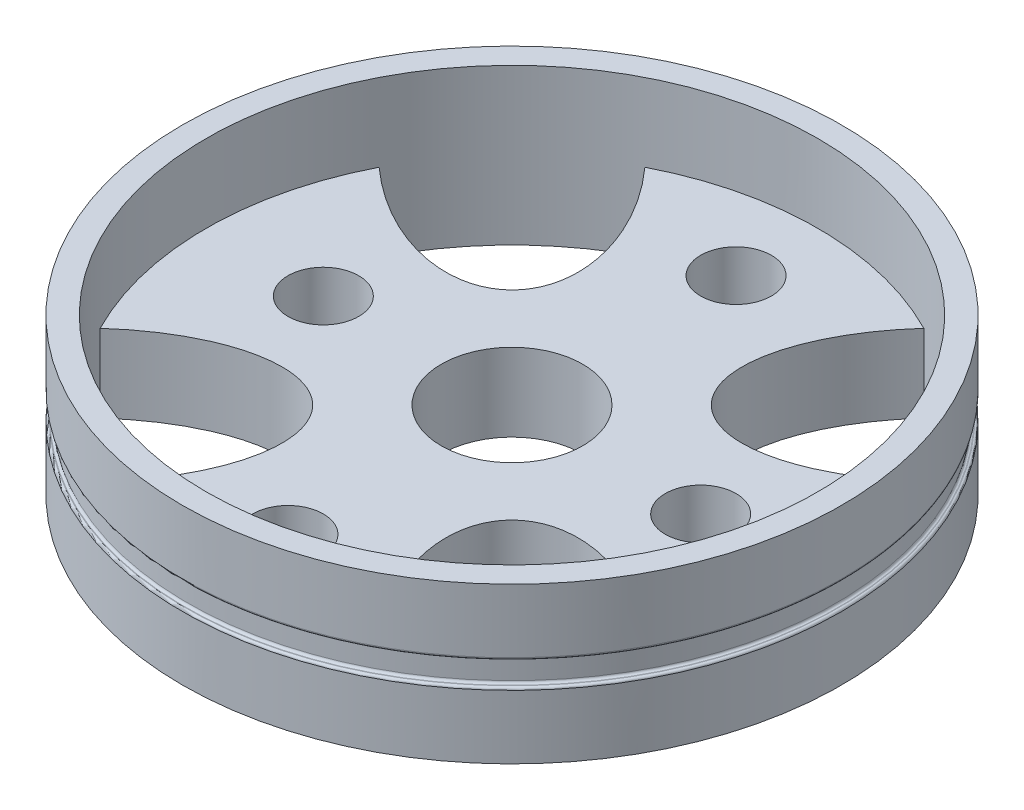
ISO-10303-21;
HEADER;
FILE_DESCRIPTION(('STEP AP214'),'2;1');
FILE_NAME('part.step','',(''),(''),'','','');
FILE_SCHEMA(('AUTOMOTIVE_DESIGN { 1 0 10303 214 1 1 1 1 }'));
ENDSEC;
DATA;
#1=APPLICATION_CONTEXT('core data for automotive mechanical design processes');
#2=APPLICATION_PROTOCOL_DEFINITION('international standard','automotive_design',2000,#1);
#3=PRODUCT_CONTEXT('',#1,'mechanical');
#4=PRODUCT('Part','Part','',(#3));
#5=PRODUCT_RELATED_PRODUCT_CATEGORY('part','',(#4));
#6=PRODUCT_DEFINITION_FORMATION('','',#4);
#7=PRODUCT_DEFINITION_CONTEXT('part definition',#1,'design');
#8=PRODUCT_DEFINITION('design','',#6,#7);
#9=PRODUCT_DEFINITION_SHAPE('','',#8);
#10=(LENGTH_UNIT() NAMED_UNIT(*) SI_UNIT(.MILLI.,.METRE.));
#11=(NAMED_UNIT(*) PLANE_ANGLE_UNIT() SI_UNIT($,.RADIAN.));
#12=(NAMED_UNIT(*) SI_UNIT($,.STERADIAN.) SOLID_ANGLE_UNIT());
#13=UNCERTAINTY_MEASURE_WITH_UNIT(LENGTH_MEASURE(1.E-05),#10,'distance_accuracy_value','');
#14=(GEOMETRIC_REPRESENTATION_CONTEXT(3) GLOBAL_UNCERTAINTY_ASSIGNED_CONTEXT((#13)) GLOBAL_UNIT_ASSIGNED_CONTEXT((#10,
#11,#12)) REPRESENTATION_CONTEXT('',''));
#15=CARTESIAN_POINT('',(0.,0.,0.));
#16=DIRECTION('',(0.,0.,1.));
#17=DIRECTION('',(1.,0.,0.));
#18=AXIS2_PLACEMENT_3D('',#15,#16,#17);
#19=CARTESIAN_POINT('',(0.,3.3,0.));
#20=DIRECTION('',(0.,1.,0.));
#21=DIRECTION('',(0.,0.,1.));
#22=AXIS2_PLACEMENT_3D('',#19,#20,#21);
#23=PLANE('',#22);
#24=CARTESIAN_POINT('',(-9.17471048589553,3.3,9.17471048589537));
#25=DIRECTION('',(0.,1.,0.));
#26=DIRECTION('',(-0.707106781186536,0.,0.707106781186559));
#27=AXIS2_PLACEMENT_3D('',#24,#25,#26);
#28=ELLIPSE('',#27,7.,4.00000000000012);
#29=CARTESIAN_POINT('',(-5.91445391265301,3.3,11.5485869228709));
#30=VERTEX_POINT('',#29);
#31=CARTESIAN_POINT('',(-11.5485869228712,3.3,5.91445391265352));
#32=VERTEX_POINT('',#31);
#33=EDGE_CURVE('E192',#30,#32,#28,.T.);
#34=ORIENTED_EDGE('',*,*,#33,.F.);
#35=CARTESIAN_POINT('',(0.,3.3,0.));
#36=DIRECTION('',(0.,1.,0.));
#37=DIRECTION('',(0.,0.,1.));
#38=AXIS2_PLACEMENT_3D('',#35,#36,#37);
#39=CIRCLE('',#38,12.975);
#40=CARTESIAN_POINT('',(5.91445391265348,3.3,11.5485869228714));
#41=VERTEX_POINT('',#40);
#42=EDGE_CURVE('E294',#30,#41,#39,.T.);
#43=ORIENTED_EDGE('',*,*,#42,.T.);
#44=CARTESIAN_POINT('',(9.1747104858954,3.3,9.1747104858955));
#45=DIRECTION('',(0.,1.,0.));
#46=DIRECTION('',(0.707106781186554,0.,0.707106781186541));
#47=AXIS2_PLACEMENT_3D('',#44,#45,#46);
#48=ELLIPSE('',#47,7.,4.00000000000006);
#49=CARTESIAN_POINT('',(11.5485869228708,3.3,5.914453912653));
#50=VERTEX_POINT('',#49);
#51=EDGE_CURVE('E156',#50,#41,#48,.T.);
#52=ORIENTED_EDGE('',*,*,#51,.F.);
#53=CARTESIAN_POINT('',(11.5485869228713,3.3,-5.91445391265322));
#54=VERTEX_POINT('',#53);
#55=EDGE_CURVE('E288',#50,#54,#39,.T.);
#56=ORIENTED_EDGE('',*,*,#55,.T.);
#57=CARTESIAN_POINT('',(9.17471048589545,3.3,-9.17471048589545));
#58=DIRECTION('',(0.,1.,0.));
#59=DIRECTION('',(0.707106781186548,0.,-0.707106781186548));
#60=AXIS2_PLACEMENT_3D('',#57,#58,#59);
#61=ELLIPSE('',#60,7.,4.);
#62=CARTESIAN_POINT('',(5.914453912653,3.3,-11.5485869228709));
#63=VERTEX_POINT('',#62);
#64=EDGE_CURVE('E117',#63,#54,#61,.T.);
#65=ORIENTED_EDGE('',*,*,#64,.F.);
#66=CARTESIAN_POINT('',(-5.91445391265325,3.3,-11.5485869228711));
#67=VERTEX_POINT('',#66);
#68=EDGE_CURVE('E452',#63,#67,#39,.T.);
#69=ORIENTED_EDGE('',*,*,#68,.T.);
#70=CARTESIAN_POINT('',(-9.17471048589534,3.3,-9.17471048589557));
#71=DIRECTION('',(0.,1.,0.));
#72=DIRECTION('',(-0.707106781186564,0.,-0.707106781186531));
#73=AXIS2_PLACEMENT_3D('',#70,#71,#72);
#74=ELLIPSE('',#73,7.,4.00000000000016);
#75=CARTESIAN_POINT('',(-11.5485869228708,3.3,-5.91445391265301));
#76=VERTEX_POINT('',#75);
#77=EDGE_CURVE('E131',#76,#67,#74,.T.);
#78=ORIENTED_EDGE('',*,*,#77,.F.);
#79=EDGE_CURVE('E125',#76,#32,#39,.T.);
#80=ORIENTED_EDGE('',*,*,#79,.T.);
#81=EDGE_LOOP('',(#34,#43,#52,#56,#65,#69,#78,#80));
#82=FACE_BOUND('',#81,.T.);
#83=CARTESIAN_POINT('',(0.,3.3,0.));
#84=DIRECTION('',(0.,1.,0.));
#85=DIRECTION('',(0.,0.,1.));
#86=AXIS2_PLACEMENT_3D('',#83,#84,#85);
#87=CIRCLE('',#86,3.);
#88=CARTESIAN_POINT('',(0.,3.3,3.));
#89=VERTEX_POINT('',#88);
#90=EDGE_CURVE('E169',#89,#89,#87,.T.);
#91=ORIENTED_EDGE('',*,*,#90,.F.);
#92=EDGE_LOOP('',(#91));
#93=FACE_BOUND('',#92,.T.);
#94=CARTESIAN_POINT('',(0.,3.3,9.5));
#95=DIRECTION('',(0.,-1.,0.));
#96=DIRECTION('',(0.,0.,-1.));
#97=AXIS2_PLACEMENT_3D('',#94,#95,#96);
#98=CIRCLE('',#97,1.5);
#99=CARTESIAN_POINT('',(0.,3.3,11.));
#100=VERTEX_POINT('',#99);
#101=EDGE_CURVE('E186',#100,#100,#98,.T.);
#102=ORIENTED_EDGE('',*,*,#101,.T.);
#103=EDGE_LOOP('',(#102));
#104=FACE_BOUND('',#103,.T.);
#105=CARTESIAN_POINT('',(0.,3.3,-9.5));
#106=DIRECTION('',(0.,1.,0.));
#107=DIRECTION('',(0.,0.,1.));
#108=AXIS2_PLACEMENT_3D('',#105,#106,#107);
#109=CIRCLE('',#108,1.5);
#110=CARTESIAN_POINT('',(0.,3.3,-8.));
#111=VERTEX_POINT('',#110);
#112=EDGE_CURVE('E182',#111,#111,#109,.T.);
#113=ORIENTED_EDGE('',*,*,#112,.F.);
#114=EDGE_LOOP('',(#113));
#115=FACE_BOUND('',#114,.T.);
#116=CARTESIAN_POINT('',(8.,3.3,0.));
#117=DIRECTION('',(0.,1.,0.));
#118=DIRECTION('',(0.,0.,1.));
#119=AXIS2_PLACEMENT_3D('',#116,#117,#118);
#120=CIRCLE('',#119,1.5);
#121=CARTESIAN_POINT('',(8.,3.3,1.5));
#122=VERTEX_POINT('',#121);
#123=EDGE_CURVE('E179',#122,#122,#120,.T.);
#124=ORIENTED_EDGE('',*,*,#123,.F.);
#125=EDGE_LOOP('',(#124));
#126=FACE_BOUND('',#125,.T.);
#127=CARTESIAN_POINT('',(-8.,3.3,0.));
#128=DIRECTION('',(0.,-1.,0.));
#129=DIRECTION('',(0.,0.,-1.));
#130=AXIS2_PLACEMENT_3D('',#127,#128,#129);
#131=CIRCLE('',#130,1.5);
#132=CARTESIAN_POINT('',(-8.,3.3,1.5));
#133=VERTEX_POINT('',#132);
#134=EDGE_CURVE('E178',#133,#133,#131,.T.);
#135=ORIENTED_EDGE('',*,*,#134,.T.);
#136=EDGE_LOOP('',(#135));
#137=FACE_BOUND('',#136,.T.);
#138=ADVANCED_FACE('F45',(#82,#93,#104,#115,#126,#137),#23,.T.);
#139=CARTESIAN_POINT('',(0.,0.,0.));
#140=DIRECTION('',(0.,1.,0.));
#141=DIRECTION('',(0.,0.,1.));
#142=AXIS2_PLACEMENT_3D('',#139,#140,#141);
#143=PLANE('',#142);
#144=CARTESIAN_POINT('',(8.,0.,0.));
#145=DIRECTION('',(0.,1.,0.));
#146=DIRECTION('',(0.,0.,1.));
#147=AXIS2_PLACEMENT_3D('',#144,#145,#146);
#148=CIRCLE('',#147,1.5);
#149=CARTESIAN_POINT('',(8.,0.,1.5));
#150=VERTEX_POINT('',#149);
#151=EDGE_CURVE('E183',#150,#150,#148,.F.);
#152=ORIENTED_EDGE('',*,*,#151,.F.);
#153=EDGE_LOOP('',(#152));
#154=FACE_BOUND('',#153,.T.);
#155=CARTESIAN_POINT('',(0.,0.,0.));
#156=DIRECTION('',(0.,1.,0.));
#157=DIRECTION('',(0.,0.,1.));
#158=AXIS2_PLACEMENT_3D('',#155,#156,#157);
#159=CIRCLE('',#158,12.9750000000004);
#160=CARTESIAN_POINT('',(-5.914453912653,0.,-11.5485869228713));
#161=VERTEX_POINT('',#160);
#162=CARTESIAN_POINT('',(-11.5485869228711,0.,-5.91445391265322));
#163=VERTEX_POINT('',#162);
#164=EDGE_CURVE('E116',#161,#163,#159,.T.);
#165=ORIENTED_EDGE('',*,*,#164,.T.);
#166=CARTESIAN_POINT('',(-9.17471048589534,0.,-9.17471048589557));
#167=DIRECTION('',(0.,1.,0.));
#168=DIRECTION('',(-0.707106781186564,0.,-0.707106781186531));
#169=AXIS2_PLACEMENT_3D('',#166,#167,#168);
#170=ELLIPSE('',#169,7.,4.00000000000016);
#171=EDGE_CURVE('E110',#161,#163,#170,.F.);
#172=ORIENTED_EDGE('',*,*,#171,.F.);
#173=EDGE_LOOP('',(#165,#172));
#174=FACE_BOUND('',#173,.T.);
#175=CARTESIAN_POINT('',(0.,0.,0.));
#176=DIRECTION('',(0.,1.,0.));
#177=DIRECTION('',(0.,0.,1.));
#178=AXIS2_PLACEMENT_3D('',#175,#176,#177);
#179=CIRCLE('',#178,12.9750000000007);
#180=CARTESIAN_POINT('',(5.91445391265336,0.,11.5485869228715));
#181=VERTEX_POINT('',#180);
#182=CARTESIAN_POINT('',(11.5485869228714,0.,5.91445391265346));
#183=VERTEX_POINT('',#182);
#184=EDGE_CURVE('E157',#181,#183,#179,.T.);
#185=ORIENTED_EDGE('',*,*,#184,.T.);
#186=CARTESIAN_POINT('',(9.1747104858954,0.,9.1747104858955));
#187=DIRECTION('',(0.,1.,0.));
#188=DIRECTION('',(0.707106781186554,0.,0.707106781186541));
#189=AXIS2_PLACEMENT_3D('',#186,#187,#188);
#190=ELLIPSE('',#189,7.,4.00000000000006);
#191=EDGE_CURVE('E161',#181,#183,#190,.F.);
#192=ORIENTED_EDGE('',*,*,#191,.F.);
#193=EDGE_LOOP('',(#185,#192));
#194=FACE_BOUND('',#193,.T.);
#195=CARTESIAN_POINT('',(0.,0.,0.));
#196=DIRECTION('',(0.,1.,0.));
#197=DIRECTION('',(0.,0.,1.));
#198=AXIS2_PLACEMENT_3D('',#195,#196,#197);
#199=CIRCLE('',#198,3.);
#200=CARTESIAN_POINT('',(0.,0.,3.));
#201=VERTEX_POINT('',#200);
#202=EDGE_CURVE('E170',#201,#201,#199,.F.);
#203=ORIENTED_EDGE('',*,*,#202,.F.);
#204=EDGE_LOOP('',(#203));
#205=FACE_BOUND('',#204,.T.);
#206=CARTESIAN_POINT('',(0.,0.,-9.5));
#207=DIRECTION('',(0.,1.,0.));
#208=DIRECTION('',(0.,0.,1.));
#209=AXIS2_PLACEMENT_3D('',#206,#207,#208);
#210=CIRCLE('',#209,1.5);
#211=CARTESIAN_POINT('',(0.,0.,-8.));
#212=VERTEX_POINT('',#211);
#213=EDGE_CURVE('E295',#212,#212,#210,.F.);
#214=ORIENTED_EDGE('',*,*,#213,.F.);
#215=EDGE_LOOP('',(#214));
#216=FACE_BOUND('',#215,.T.);
#217=CARTESIAN_POINT('',(0.,0.,0.));
#218=DIRECTION('',(0.,1.,0.));
#219=DIRECTION('',(0.,0.,1.));
#220=AXIS2_PLACEMENT_3D('',#217,#218,#219);
#221=CIRCLE('',#220,13.975);
#222=CARTESIAN_POINT('',(0.,0.,13.975));
#223=VERTEX_POINT('',#222);
#224=EDGE_CURVE('E285',#223,#223,#221,.T.);
#225=ORIENTED_EDGE('',*,*,#224,.F.);
#226=EDGE_LOOP('',(#225));
#227=FACE_BOUND('',#226,.T.);
#228=CARTESIAN_POINT('',(0.,0.,0.));
#229=DIRECTION('',(0.,1.,0.));
#230=DIRECTION('',(0.,0.,1.));
#231=AXIS2_PLACEMENT_3D('',#228,#229,#230);
#232=CIRCLE('',#231,12.9750000000005);
#233=CARTESIAN_POINT('',(11.5485869228712,0.,-5.91445391265333));
#234=VERTEX_POINT('',#233);
#235=CARTESIAN_POINT('',(5.91445391265348,0.,-11.5485869228712));
#236=VERTEX_POINT('',#235);
#237=EDGE_CURVE('E155',#234,#236,#232,.T.);
#238=ORIENTED_EDGE('',*,*,#237,.T.);
#239=CARTESIAN_POINT('',(9.17471048589545,0.,-9.17471048589545));
#240=DIRECTION('',(0.,1.,0.));
#241=DIRECTION('',(0.707106781186548,0.,-0.707106781186548));
#242=AXIS2_PLACEMENT_3D('',#239,#240,#241);
#243=ELLIPSE('',#242,7.,4.);
#244=EDGE_CURVE('E153',#234,#236,#243,.F.);
#245=ORIENTED_EDGE('',*,*,#244,.F.);
#246=EDGE_LOOP('',(#238,#245));
#247=FACE_BOUND('',#246,.T.);
#248=CARTESIAN_POINT('',(0.,0.,0.));
#249=DIRECTION('',(0.,1.,0.));
#250=DIRECTION('',(0.,0.,1.));
#251=AXIS2_PLACEMENT_3D('',#248,#249,#250);
#252=CIRCLE('',#251,12.9750000000005);
#253=CARTESIAN_POINT('',(-11.5485869228714,0.,5.91445391265321));
#254=VERTEX_POINT('',#253);
#255=CARTESIAN_POINT('',(-5.9144539126532,0.,11.5485869228713));
#256=VERTEX_POINT('',#255);
#257=EDGE_CURVE('E195',#254,#256,#252,.T.);
#258=ORIENTED_EDGE('',*,*,#257,.T.);
#259=CARTESIAN_POINT('',(-9.17471048589553,0.,9.17471048589537));
#260=DIRECTION('',(0.,1.,0.));
#261=DIRECTION('',(-0.707106781186536,0.,0.707106781186559));
#262=AXIS2_PLACEMENT_3D('',#259,#260,#261);
#263=ELLIPSE('',#262,7.,4.00000000000012);
#264=EDGE_CURVE('E134',#254,#256,#263,.F.);
#265=ORIENTED_EDGE('',*,*,#264,.F.);
#266=EDGE_LOOP('',(#258,#265));
#267=FACE_BOUND('',#266,.T.);
#268=CARTESIAN_POINT('',(0.,0.,9.5));
#269=DIRECTION('',(0.,1.,0.));
#270=DIRECTION('',(0.,0.,1.));
#271=AXIS2_PLACEMENT_3D('',#268,#269,#270);
#272=CIRCLE('',#271,1.5);
#273=CARTESIAN_POINT('',(0.,0.,11.));
#274=VERTEX_POINT('',#273);
#275=EDGE_CURVE('E189',#274,#274,#272,.T.);
#276=ORIENTED_EDGE('',*,*,#275,.T.);
#277=EDGE_LOOP('',(#276));
#278=FACE_BOUND('',#277,.T.);
#279=CARTESIAN_POINT('',(-8.,0.,0.));
#280=DIRECTION('',(0.,1.,0.));
#281=DIRECTION('',(0.,0.,1.));
#282=AXIS2_PLACEMENT_3D('',#279,#280,#281);
#283=CIRCLE('',#282,1.5);
#284=CARTESIAN_POINT('',(-8.,0.,1.5));
#285=VERTEX_POINT('',#284);
#286=EDGE_CURVE('E175',#285,#285,#283,.T.);
#287=ORIENTED_EDGE('',*,*,#286,.T.);
#288=EDGE_LOOP('',(#287));
#289=FACE_BOUND('',#288,.T.);
#290=ADVANCED_FACE('F127',(#154,#174,#194,#205,#216,#227,#247,#267,#278,#289),#143,.F.);
#291=CARTESIAN_POINT('',(0.,6.6,0.));
#292=DIRECTION('',(0.,-1.,0.));
#293=DIRECTION('',(0.,0.,-1.));
#294=AXIS2_PLACEMENT_3D('',#291,#292,#293);
#295=CYLINDRICAL_SURFACE('',#294,13.975);
#296=CARTESIAN_POINT('',(0.,3.9,0.));
#297=DIRECTION('',(0.,1.,0.));
#298=DIRECTION('',(-1.,0.,0.));
#299=AXIS2_PLACEMENT_3D('',#296,#297,#298);
#300=CIRCLE('',#299,13.975);
#301=CARTESIAN_POINT('',(-13.975,3.9,0.));
#302=VERTEX_POINT('',#301);
#303=EDGE_CURVE('E281',#302,#302,#300,.T.);
#304=ORIENTED_EDGE('',*,*,#303,.T.);
#305=EDGE_LOOP('',(#304));
#306=FACE_BOUND('',#305,.T.);
#307=CARTESIAN_POINT('',(0.,6.6,0.));
#308=DIRECTION('',(0.,1.,0.));
#309=DIRECTION('',(0.,0.,1.));
#310=AXIS2_PLACEMENT_3D('',#307,#308,#309);
#311=CIRCLE('',#310,13.975);
#312=CARTESIAN_POINT('',(0.,6.6,13.975));
#313=VERTEX_POINT('',#312);
#314=EDGE_CURVE('E284',#313,#313,#311,.T.);
#315=ORIENTED_EDGE('',*,*,#314,.F.);
#316=EDGE_LOOP('',(#315));
#317=FACE_BOUND('',#316,.T.);
#318=ADVANCED_FACE('F237',(#306,#317),#295,.T.);
#319=CARTESIAN_POINT('',(0.,6.6,0.));
#320=DIRECTION('',(0.,1.,0.));
#321=DIRECTION('',(0.,0.,1.));
#322=AXIS2_PLACEMENT_3D('',#319,#320,#321);
#323=PLANE('',#322);
#324=CARTESIAN_POINT('',(0.,6.6,0.));
#325=DIRECTION('',(0.,1.,0.));
#326=DIRECTION('',(0.,0.,1.));
#327=AXIS2_PLACEMENT_3D('',#324,#325,#326);
#328=CIRCLE('',#327,12.975);
#329=CARTESIAN_POINT('',(0.,6.6,12.975));
#330=VERTEX_POINT('',#329);
#331=EDGE_CURVE('E291',#330,#330,#328,.T.);
#332=ORIENTED_EDGE('',*,*,#331,.F.);
#333=EDGE_LOOP('',(#332));
#334=FACE_BOUND('',#333,.T.);
#335=ORIENTED_EDGE('',*,*,#314,.T.);
#336=EDGE_LOOP('',(#335));
#337=FACE_BOUND('',#336,.T.);
#338=ADVANCED_FACE('F234',(#334,#337),#323,.T.);
#339=CARTESIAN_POINT('',(0.,3.3,0.));
#340=DIRECTION('',(0.,1.,0.));
#341=DIRECTION('',(0.,0.,1.));
#342=AXIS2_PLACEMENT_3D('',#339,#340,#341);
#343=CYLINDRICAL_SURFACE('',#342,12.975);
#344=ORIENTED_EDGE('',*,*,#55,.F.);
#345=DIRECTION('',(0.,1.,0.));
#346=VECTOR('',#345,1.);
#347=CARTESIAN_POINT('',(11.5485869228714,-11.4194260008678,5.91445391265346));
#348=LINE('',#347,#346);
#349=EDGE_CURVE('E160',#183,#50,#348,.T.);
#350=ORIENTED_EDGE('',*,*,#349,.F.);
#351=ORIENTED_EDGE('',*,*,#184,.F.);
#352=DIRECTION('',(0.,1.,0.));
#353=VECTOR('',#352,1.);
#354=CARTESIAN_POINT('',(5.91445391265348,-11.4194260008678,11.5485869228714));
#355=LINE('',#354,#353);
#356=EDGE_CURVE('E162',#181,#41,#355,.T.);
#357=ORIENTED_EDGE('',*,*,#356,.T.);
#358=ORIENTED_EDGE('',*,*,#42,.F.);
#359=DIRECTION('',(0.,1.,0.));
#360=VECTOR('',#359,1.);
#361=CARTESIAN_POINT('',(-5.9144539126532,-11.4194260008678,11.5485869228713));
#362=LINE('',#361,#360);
#363=EDGE_CURVE('E60',#256,#30,#362,.T.);
#364=ORIENTED_EDGE('',*,*,#363,.F.);
#365=ORIENTED_EDGE('',*,*,#257,.F.);
#366=DIRECTION('',(0.,1.,0.));
#367=VECTOR('',#366,1.);
#368=CARTESIAN_POINT('',(-11.5485869228712,-11.4194260008678,5.91445391265352));
#369=LINE('',#368,#367);
#370=EDGE_CURVE('E198',#254,#32,#369,.T.);
#371=ORIENTED_EDGE('',*,*,#370,.T.);
#372=ORIENTED_EDGE('',*,*,#79,.F.);
#373=DIRECTION('',(0.,1.,0.));
#374=VECTOR('',#373,1.);
#375=CARTESIAN_POINT('',(-11.5485869228711,-11.4194260008678,-5.91445391265322));
#376=LINE('',#375,#374);
#377=EDGE_CURVE('E68',#163,#76,#376,.T.);
#378=ORIENTED_EDGE('',*,*,#377,.F.);
#379=ORIENTED_EDGE('',*,*,#164,.F.);
#380=DIRECTION('',(0.,1.,0.));
#381=VECTOR('',#380,1.);
#382=CARTESIAN_POINT('',(-5.91445391265325,-11.4194260008678,-11.5485869228711));
#383=LINE('',#382,#381);
#384=EDGE_CURVE('E112',#161,#67,#383,.T.);
#385=ORIENTED_EDGE('',*,*,#384,.T.);
#386=ORIENTED_EDGE('',*,*,#68,.F.);
#387=DIRECTION('',(0.,1.,0.));
#388=VECTOR('',#387,1.);
#389=CARTESIAN_POINT('',(5.91445391265348,-11.4194260008678,-11.5485869228712));
#390=LINE('',#389,#388);
#391=EDGE_CURVE('E459',#236,#63,#390,.T.);
#392=ORIENTED_EDGE('',*,*,#391,.F.);
#393=ORIENTED_EDGE('',*,*,#237,.F.);
#394=DIRECTION('',(0.,1.,0.));
#395=VECTOR('',#394,1.);
#396=CARTESIAN_POINT('',(11.5485869228713,-11.4194260008678,-5.91445391265322));
#397=LINE('',#396,#395);
#398=EDGE_CURVE('E457',#234,#54,#397,.T.);
#399=ORIENTED_EDGE('',*,*,#398,.T.);
#400=EDGE_LOOP('',(#344,#350,#351,#357,#358,#364,#365,#371,#372,#378,#379,#385,#386,#392,#393,#399));
#401=FACE_BOUND('',#400,.T.);
#402=ORIENTED_EDGE('',*,*,#331,.T.);
#403=EDGE_LOOP('',(#402));
#404=FACE_BOUND('',#403,.T.);
#405=ADVANCED_FACE('F122',(#401,#404),#343,.F.);
#406=CARTESIAN_POINT('',(0.,3.8,0.));
#407=DIRECTION('',(0.,1.,0.));
#408=DIRECTION('',(-1.,0.,0.));
#409=AXIS2_PLACEMENT_3D('',#406,#407,#408);
#410=PLANE('',#409);
#411=CARTESIAN_POINT('',(0.,3.8,0.));
#412=DIRECTION('',(0.,1.,0.));
#413=DIRECTION('',(-1.,0.,0.));
#414=AXIS2_PLACEMENT_3D('',#411,#412,#413);
#415=CIRCLE('',#414,13.875);
#416=CARTESIAN_POINT('',(-13.875,3.8,0.));
#417=VERTEX_POINT('',#416);
#418=EDGE_CURVE('E275',#417,#417,#415,.F.);
#419=ORIENTED_EDGE('',*,*,#418,.T.);
#420=EDGE_LOOP('',(#419));
#421=FACE_BOUND('',#420,.T.);
#422=CARTESIAN_POINT('',(0.,3.8,0.));
#423=DIRECTION('',(0.,1.,0.));
#424=DIRECTION('',(-1.,0.,0.));
#425=AXIS2_PLACEMENT_3D('',#422,#423,#424);
#426=CIRCLE('',#425,13.85);
#427=CARTESIAN_POINT('',(-13.85,3.8,0.));
#428=VERTEX_POINT('',#427);
#429=EDGE_CURVE('E278',#428,#428,#426,.T.);
#430=ORIENTED_EDGE('',*,*,#429,.T.);
#431=EDGE_LOOP('',(#430));
#432=FACE_BOUND('',#431,.T.);
#433=ADVANCED_FACE('F224',(#421,#432),#410,.F.);
#434=CARTESIAN_POINT('',(0.,3.8,0.));
#435=DIRECTION('',(0.,-1.,0.));
#436=DIRECTION('',(1.,0.,0.));
#437=AXIS2_PLACEMENT_3D('',#434,#435,#436);
#438=CYLINDRICAL_SURFACE('',#437,13.75);
#439=CARTESIAN_POINT('',(0.,2.9,0.));
#440=DIRECTION('',(0.,1.,0.));
#441=DIRECTION('',(-1.,0.,0.));
#442=AXIS2_PLACEMENT_3D('',#439,#440,#441);
#443=CIRCLE('',#442,13.75);
#444=CARTESIAN_POINT('',(-13.75,2.9,0.));
#445=VERTEX_POINT('',#444);
#446=EDGE_CURVE('E11',#445,#445,#443,.T.);
#447=ORIENTED_EDGE('',*,*,#446,.T.);
#448=EDGE_LOOP('',(#447));
#449=FACE_BOUND('',#448,.T.);
#450=CARTESIAN_POINT('',(0.,3.7,0.));
#451=DIRECTION('',(0.,1.,0.));
#452=DIRECTION('',(-1.,0.,0.));
#453=AXIS2_PLACEMENT_3D('',#450,#451,#452);
#454=CIRCLE('',#453,13.75);
#455=CARTESIAN_POINT('',(-13.75,3.7,0.));
#456=VERTEX_POINT('',#455);
#457=EDGE_CURVE('E53',#456,#456,#454,.F.);
#458=ORIENTED_EDGE('',*,*,#457,.T.);
#459=EDGE_LOOP('',(#458));
#460=FACE_BOUND('',#459,.T.);
#461=ADVANCED_FACE('F220',(#449,#460),#438,.T.);
#462=CARTESIAN_POINT('',(0.,2.8,0.));
#463=DIRECTION('',(0.,1.,0.));
#464=DIRECTION('',(-1.,0.,0.));
#465=AXIS2_PLACEMENT_3D('',#462,#463,#464);
#466=PLANE('',#465);
#467=CARTESIAN_POINT('',(0.,2.8,0.));
#468=DIRECTION('',(0.,1.,0.));
#469=DIRECTION('',(-1.,0.,0.));
#470=AXIS2_PLACEMENT_3D('',#467,#468,#469);
#471=CIRCLE('',#470,13.875);
#472=CARTESIAN_POINT('',(-13.875,2.8,0.));
#473=VERTEX_POINT('',#472);
#474=EDGE_CURVE('E269',#473,#473,#471,.T.);
#475=ORIENTED_EDGE('',*,*,#474,.T.);
#476=EDGE_LOOP('',(#475));
#477=FACE_BOUND('',#476,.T.);
#478=CARTESIAN_POINT('',(0.,2.8,0.));
#479=DIRECTION('',(0.,1.,0.));
#480=DIRECTION('',(-1.,0.,0.));
#481=AXIS2_PLACEMENT_3D('',#478,#479,#480);
#482=CIRCLE('',#481,13.85);
#483=CARTESIAN_POINT('',(-13.85,2.8,0.));
#484=VERTEX_POINT('',#483);
#485=EDGE_CURVE('E262',#484,#484,#482,.F.);
#486=ORIENTED_EDGE('',*,*,#485,.T.);
#487=EDGE_LOOP('',(#486));
#488=FACE_BOUND('',#487,.T.);
#489=ADVANCED_FACE('F216',(#477,#488),#466,.T.);
#490=CARTESIAN_POINT('',(0.,2.7,0.));
#491=DIRECTION('',(0.,1.,0.));
#492=DIRECTION('',(-1.,0.,0.));
#493=AXIS2_PLACEMENT_3D('',#490,#491,#492);
#494=CIRCLE('',#493,13.975);
#495=CARTESIAN_POINT('',(-13.975,2.7,0.));
#496=VERTEX_POINT('',#495);
#497=EDGE_CURVE('E267',#496,#496,#494,.F.);
#498=ORIENTED_EDGE('',*,*,#497,.T.);
#499=EDGE_LOOP('',(#498));
#500=FACE_BOUND('',#499,.T.);
#501=ORIENTED_EDGE('',*,*,#224,.T.);
#502=EDGE_LOOP('',(#501));
#503=FACE_BOUND('',#502,.T.);
#504=ADVANCED_FACE('F219',(#500,#503),#295,.T.);
#505=CARTESIAN_POINT('',(0.,3.9,0.));
#506=DIRECTION('',(0.,1.,0.));
#507=DIRECTION('',(-1.,0.,0.));
#508=AXIS2_PLACEMENT_3D('',#505,#506,#507);
#509=TOROIDAL_SURFACE('',#508,13.875,0.1);
#510=ORIENTED_EDGE('',*,*,#418,.F.);
#511=EDGE_LOOP('',(#510));
#512=FACE_BOUND('',#511,.T.);
#513=ORIENTED_EDGE('',*,*,#303,.F.);
#514=EDGE_LOOP('',(#513));
#515=FACE_BOUND('',#514,.T.);
#516=ADVANCED_FACE('F245',(#512,#515),#509,.T.);
#517=CARTESIAN_POINT('',(0.,2.7,0.));
#518=DIRECTION('',(0.,1.,0.));
#519=DIRECTION('',(-1.,0.,0.));
#520=AXIS2_PLACEMENT_3D('',#517,#518,#519);
#521=TOROIDAL_SURFACE('',#520,13.875,0.1);
#522=ORIENTED_EDGE('',*,*,#497,.F.);
#523=EDGE_LOOP('',(#522));
#524=FACE_BOUND('',#523,.T.);
#525=ORIENTED_EDGE('',*,*,#474,.F.);
#526=EDGE_LOOP('',(#525));
#527=FACE_BOUND('',#526,.T.);
#528=ADVANCED_FACE('F248',(#524,#527),#521,.T.);
#529=CARTESIAN_POINT('',(0.,2.9,0.));
#530=DIRECTION('',(0.,1.,0.));
#531=DIRECTION('',(-1.,0.,0.));
#532=AXIS2_PLACEMENT_3D('',#529,#530,#531);
#533=TOROIDAL_SURFACE('',#532,13.85,0.1);
#534=ORIENTED_EDGE('',*,*,#485,.F.);
#535=EDGE_LOOP('',(#534));
#536=FACE_BOUND('',#535,.T.);
#537=ORIENTED_EDGE('',*,*,#446,.F.);
#538=EDGE_LOOP('',(#537));
#539=FACE_BOUND('',#538,.T.);
#540=ADVANCED_FACE('F251',(#536,#539),#533,.F.);
#541=CARTESIAN_POINT('',(0.,3.7,0.));
#542=DIRECTION('',(0.,1.,0.));
#543=DIRECTION('',(-1.,0.,0.));
#544=AXIS2_PLACEMENT_3D('',#541,#542,#543);
#545=TOROIDAL_SURFACE('',#544,13.85,0.1);
#546=ORIENTED_EDGE('',*,*,#457,.F.);
#547=EDGE_LOOP('',(#546));
#548=FACE_BOUND('',#547,.T.);
#549=ORIENTED_EDGE('',*,*,#429,.F.);
#550=EDGE_LOOP('',(#549));
#551=FACE_BOUND('',#550,.T.);
#552=ADVANCED_FACE('F47',(#548,#551),#545,.F.);
#553=CARTESIAN_POINT('',(0.,-11.4194260008678,-9.5));
#554=DIRECTION('',(0.,1.,0.));
#555=DIRECTION('',(0.,0.,1.));
#556=AXIS2_PLACEMENT_3D('',#553,#554,#555);
#557=CYLINDRICAL_SURFACE('',#556,1.5);
#558=CARTESIAN_POINT('',(0.,0.,-8.));
#559=CARTESIAN_POINT('',(0.,0.0343749999999985,-8.));
#560=CARTESIAN_POINT('',(0.,0.0687499999999988,-8.));
#561=CARTESIAN_POINT('',(0.,0.137499999999999,-8.));
#562=CARTESIAN_POINT('',(0.,0.171874999999998,-8.));
#563=CARTESIAN_POINT('',(0.,0.240624999999998,-8.));
#564=CARTESIAN_POINT('',(0.,0.274999999999999,-8.));
#565=CARTESIAN_POINT('',(0.,0.343749999999999,-8.));
#566=CARTESIAN_POINT('',(0.,0.378124999999998,-8.));
#567=CARTESIAN_POINT('',(0.,0.446874999999998,-8.));
#568=CARTESIAN_POINT('',(0.,0.481249999999998,-8.));
#569=CARTESIAN_POINT('',(0.,0.549999999999998,-8.));
#570=CARTESIAN_POINT('',(0.,0.584374999999998,-8.));
#571=CARTESIAN_POINT('',(0.,0.653124999999998,-8.));
#572=CARTESIAN_POINT('',(0.,0.687499999999998,-8.));
#573=CARTESIAN_POINT('',(0.,0.756249999999998,-8.));
#574=CARTESIAN_POINT('',(0.,0.790624999999998,-8.));
#575=CARTESIAN_POINT('',(0.,0.859374999999998,-8.));
#576=CARTESIAN_POINT('',(0.,0.893749999999998,-8.));
#577=CARTESIAN_POINT('',(0.,0.962499999999999,-8.));
#578=CARTESIAN_POINT('',(0.,0.996874999999999,-8.));
#579=CARTESIAN_POINT('',(0.,1.065625,-8.));
#580=CARTESIAN_POINT('',(0.,1.1,-8.));
#581=CARTESIAN_POINT('',(0.,1.16875,-8.));
#582=CARTESIAN_POINT('',(0.,1.203125,-8.));
#583=CARTESIAN_POINT('',(0.,1.271875,-8.));
#584=CARTESIAN_POINT('',(0.,1.30625,-8.));
#585=CARTESIAN_POINT('',(0.,1.375,-8.));
#586=CARTESIAN_POINT('',(0.,1.409375,-8.));
#587=CARTESIAN_POINT('',(0.,1.478125,-8.));
#588=CARTESIAN_POINT('',(0.,1.5125,-8.));
#589=CARTESIAN_POINT('',(0.,1.58125,-8.));
#590=CARTESIAN_POINT('',(0.,1.615625,-8.));
#591=CARTESIAN_POINT('',(0.,1.684375,-8.));
#592=CARTESIAN_POINT('',(0.,1.71875,-8.));
#593=CARTESIAN_POINT('',(0.,1.7875,-8.));
#594=CARTESIAN_POINT('',(0.,1.821875,-8.));
#595=CARTESIAN_POINT('',(0.,1.890625,-8.));
#596=CARTESIAN_POINT('',(0.,1.925,-8.));
#597=CARTESIAN_POINT('',(0.,1.99375,-8.));
#598=CARTESIAN_POINT('',(0.,2.028125,-8.));
#599=CARTESIAN_POINT('',(0.,2.096875,-8.));
#600=CARTESIAN_POINT('',(0.,2.13125,-8.));
#601=CARTESIAN_POINT('',(0.,2.2,-8.));
#602=CARTESIAN_POINT('',(0.,2.234375,-8.));
#603=CARTESIAN_POINT('',(0.,2.303125,-8.));
#604=CARTESIAN_POINT('',(0.,2.3375,-8.));
#605=CARTESIAN_POINT('',(0.,2.40625,-8.));
#606=CARTESIAN_POINT('',(0.,2.440625,-8.));
#607=CARTESIAN_POINT('',(0.,2.509375,-8.));
#608=CARTESIAN_POINT('',(0.,2.54375,-8.));
#609=CARTESIAN_POINT('',(0.,2.6125,-8.));
#610=CARTESIAN_POINT('',(0.,2.646875,-8.));
#611=CARTESIAN_POINT('',(0.,2.715625,-8.));
#612=CARTESIAN_POINT('',(0.,2.75,-8.));
#613=CARTESIAN_POINT('',(0.,2.81875,-8.));
#614=CARTESIAN_POINT('',(0.,2.853125,-8.));
#615=CARTESIAN_POINT('',(0.,2.921875,-8.));
#616=CARTESIAN_POINT('',(0.,2.95625,-8.));
#617=CARTESIAN_POINT('',(0.,3.025,-8.));
#618=CARTESIAN_POINT('',(0.,3.059375,-8.));
#619=CARTESIAN_POINT('',(0.,3.128125,-8.));
#620=CARTESIAN_POINT('',(0.,3.1625,-8.));
#621=CARTESIAN_POINT('',(0.,3.23125,-8.));
#622=CARTESIAN_POINT('',(0.,3.265625,-8.));
#623=CARTESIAN_POINT('',(0.,3.3,-8.));
#624=B_SPLINE_CURVE_WITH_KNOTS('',3,(#558,#559,#560,#561,#562,#563,#564,#565,#566,#567,#568,
#569,#570,#571,#572,#573,#574,#575,#576,#577,#578,#579,#580,#581,#582,#583,#584,#585,#586,#587,
#588,#589,#590,#591,#592,#593,#594,#595,#596,#597,#598,#599,#600,#601,#602,#603,#604,#605,#606,
#607,#608,#609,#610,#611,#612,#613,#614,#615,#616,#617,#618,#619,#620,#621,#622,#623),
.UNSPECIFIED.,.F.,.F.,(4,2,2,2,2,2,2,2,2,2,2,2,2,2,2,2,2,2,2,2,2,2,2,2,2,2,2,2,2,2,2,2,4),(0.,
0.103125000000001,0.20625,0.309375000000001,0.4125,0.515625,0.618749999999999,0.721875,
0.824999999999999,0.928125,1.03125,1.134375,1.2375,1.340625,1.44375,1.546875,1.65,1.753125,
1.85625,1.959375,2.0625,2.165625,2.26875,2.371875,2.475,2.578125,2.68125,2.784375,2.8875,
2.990625,3.09375,3.196875,3.3),.UNSPECIFIED.);
#625=EDGE_CURVE('BSEAM211',#212,#111,#624,.T.);
#626=ORIENTED_EDGE('',*,*,#213,.T.);
#627=ORIENTED_EDGE('',*,*,#112,.T.);
#628=ORIENTED_EDGE('',*,*,#625,.T.);
#629=ORIENTED_EDGE('',*,*,#625,.F.);
#630=EDGE_LOOP('',(#626,#628,#627,#629));
#631=FACE_BOUND('',#630,.T.);
#632=ADVANCED_FACE('F211',(#631),#557,.F.);
#633=CARTESIAN_POINT('',(0.,-11.4194260008678,0.));
#634=DIRECTION('',(0.,1.,0.));
#635=DIRECTION('',(0.,0.,1.));
#636=AXIS2_PLACEMENT_3D('',#633,#634,#635);
#637=CYLINDRICAL_SURFACE('',#636,3.);
#638=CARTESIAN_POINT('',(0.,0.,3.));
#639=CARTESIAN_POINT('',(0.,0.0343749999999985,3.));
#640=CARTESIAN_POINT('',(0.,0.0687499999999988,3.));
#641=CARTESIAN_POINT('',(0.,0.137499999999999,3.));
#642=CARTESIAN_POINT('',(0.,0.171874999999998,3.));
#643=CARTESIAN_POINT('',(0.,0.240624999999998,3.));
#644=CARTESIAN_POINT('',(0.,0.274999999999999,3.));
#645=CARTESIAN_POINT('',(0.,0.343749999999999,3.));
#646=CARTESIAN_POINT('',(0.,0.378124999999998,3.));
#647=CARTESIAN_POINT('',(0.,0.446874999999998,3.));
#648=CARTESIAN_POINT('',(0.,0.481249999999998,3.));
#649=CARTESIAN_POINT('',(0.,0.549999999999998,3.));
#650=CARTESIAN_POINT('',(0.,0.584374999999998,3.));
#651=CARTESIAN_POINT('',(0.,0.653124999999998,3.));
#652=CARTESIAN_POINT('',(0.,0.687499999999998,3.));
#653=CARTESIAN_POINT('',(0.,0.756249999999998,3.));
#654=CARTESIAN_POINT('',(0.,0.790624999999998,3.));
#655=CARTESIAN_POINT('',(0.,0.859374999999998,3.));
#656=CARTESIAN_POINT('',(0.,0.893749999999998,3.));
#657=CARTESIAN_POINT('',(0.,0.962499999999999,3.));
#658=CARTESIAN_POINT('',(0.,0.996874999999999,3.));
#659=CARTESIAN_POINT('',(0.,1.065625,3.));
#660=CARTESIAN_POINT('',(0.,1.1,3.));
#661=CARTESIAN_POINT('',(0.,1.16875,3.));
#662=CARTESIAN_POINT('',(0.,1.203125,3.));
#663=CARTESIAN_POINT('',(0.,1.271875,3.));
#664=CARTESIAN_POINT('',(0.,1.30625,3.));
#665=CARTESIAN_POINT('',(0.,1.375,3.));
#666=CARTESIAN_POINT('',(0.,1.409375,3.));
#667=CARTESIAN_POINT('',(0.,1.478125,3.));
#668=CARTESIAN_POINT('',(0.,1.5125,3.));
#669=CARTESIAN_POINT('',(0.,1.58125,3.));
#670=CARTESIAN_POINT('',(0.,1.615625,3.));
#671=CARTESIAN_POINT('',(0.,1.684375,3.));
#672=CARTESIAN_POINT('',(0.,1.71875,3.));
#673=CARTESIAN_POINT('',(0.,1.7875,3.));
#674=CARTESIAN_POINT('',(0.,1.821875,3.));
#675=CARTESIAN_POINT('',(0.,1.890625,3.));
#676=CARTESIAN_POINT('',(0.,1.925,3.));
#677=CARTESIAN_POINT('',(0.,1.99375,3.));
#678=CARTESIAN_POINT('',(0.,2.028125,3.));
#679=CARTESIAN_POINT('',(0.,2.096875,3.));
#680=CARTESIAN_POINT('',(0.,2.13125,3.));
#681=CARTESIAN_POINT('',(0.,2.2,3.));
#682=CARTESIAN_POINT('',(0.,2.234375,3.));
#683=CARTESIAN_POINT('',(0.,2.303125,3.));
#684=CARTESIAN_POINT('',(0.,2.3375,3.));
#685=CARTESIAN_POINT('',(0.,2.40625,3.));
#686=CARTESIAN_POINT('',(0.,2.440625,3.));
#687=CARTESIAN_POINT('',(0.,2.509375,3.));
#688=CARTESIAN_POINT('',(0.,2.54375,3.));
#689=CARTESIAN_POINT('',(0.,2.6125,3.));
#690=CARTESIAN_POINT('',(0.,2.646875,3.));
#691=CARTESIAN_POINT('',(0.,2.715625,3.));
#692=CARTESIAN_POINT('',(0.,2.75,3.));
#693=CARTESIAN_POINT('',(0.,2.81875,3.));
#694=CARTESIAN_POINT('',(0.,2.853125,3.));
#695=CARTESIAN_POINT('',(0.,2.921875,3.));
#696=CARTESIAN_POINT('',(0.,2.95625,3.));
#697=CARTESIAN_POINT('',(0.,3.025,3.));
#698=CARTESIAN_POINT('',(0.,3.059375,3.));
#699=CARTESIAN_POINT('',(0.,3.128125,3.));
#700=CARTESIAN_POINT('',(0.,3.1625,3.));
#701=CARTESIAN_POINT('',(0.,3.23125,3.));
#702=CARTESIAN_POINT('',(0.,3.265625,3.));
#703=CARTESIAN_POINT('',(0.,3.3,3.));
#704=B_SPLINE_CURVE_WITH_KNOTS('',3,(#638,#639,#640,#641,#642,#643,#644,#645,#646,#647,#648,
#649,#650,#651,#652,#653,#654,#655,#656,#657,#658,#659,#660,#661,#662,#663,#664,#665,#666,#667,
#668,#669,#670,#671,#672,#673,#674,#675,#676,#677,#678,#679,#680,#681,#682,#683,#684,#685,#686,
#687,#688,#689,#690,#691,#692,#693,#694,#695,#696,#697,#698,#699,#700,#701,#702,#703),
.UNSPECIFIED.,.F.,.F.,(4,2,2,2,2,2,2,2,2,2,2,2,2,2,2,2,2,2,2,2,2,2,2,2,2,2,2,2,2,2,2,2,4),(0.,
0.103125000000001,0.20625,0.309375000000001,0.4125,0.515625,0.618749999999999,0.721875,
0.824999999999999,0.928125,1.03125,1.134375,1.2375,1.340625,1.44375,1.546875,1.65,1.753125,
1.85625,1.959375,2.0625,2.165625,2.26875,2.371875,2.475,2.578125,2.68125,2.784375,2.8875,
2.990625,3.09375,3.196875,3.3),.UNSPECIFIED.);
#705=EDGE_CURVE('BSEAM214',#201,#89,#704,.T.);
#706=ORIENTED_EDGE('',*,*,#202,.T.);
#707=ORIENTED_EDGE('',*,*,#90,.T.);
#708=ORIENTED_EDGE('',*,*,#705,.T.);
#709=ORIENTED_EDGE('',*,*,#705,.F.);
#710=EDGE_LOOP('',(#706,#708,#707,#709));
#711=FACE_BOUND('',#710,.T.);
#712=ADVANCED_FACE('F214',(#711),#637,.F.);
#713=CARTESIAN_POINT('',(9.1747104858954,-11.4194260008678,9.1747104858955));
#714=DIRECTION('',(0.,1.,0.));
#715=DIRECTION('',(0.707106781186554,0.,0.707106781186541));
#716=AXIS2_PLACEMENT_3D('',#713,#714,#715);
#717=ELLIPSE('',#716,7.,4.00000000000006);
#718=DIRECTION('',(0.,1.,0.));
#719=VECTOR('',#718,1.);
#720=SURFACE_OF_LINEAR_EXTRUSION('',#717,#719);
#721=ORIENTED_EDGE('',*,*,#191,.T.);
#722=ORIENTED_EDGE('',*,*,#349,.T.);
#723=ORIENTED_EDGE('',*,*,#51,.T.);
#724=ORIENTED_EDGE('',*,*,#356,.F.);
#725=EDGE_LOOP('',(#721,#722,#723,#724));
#726=FACE_BOUND('',#725,.T.);
#727=ADVANCED_FACE('F145',(#726),#720,.F.);
#728=CARTESIAN_POINT('',(9.17471048589545,-11.4194260008678,-9.17471048589545));
#729=DIRECTION('',(0.,1.,0.));
#730=DIRECTION('',(0.707106781186548,0.,-0.707106781186548));
#731=AXIS2_PLACEMENT_3D('',#728,#729,#730);
#732=ELLIPSE('',#731,7.,4.);
#733=DIRECTION('',(0.,1.,0.));
#734=VECTOR('',#733,1.);
#735=SURFACE_OF_LINEAR_EXTRUSION('',#732,#734);
#736=ORIENTED_EDGE('',*,*,#244,.T.);
#737=ORIENTED_EDGE('',*,*,#391,.T.);
#738=ORIENTED_EDGE('',*,*,#64,.T.);
#739=ORIENTED_EDGE('',*,*,#398,.F.);
#740=EDGE_LOOP('',(#736,#737,#738,#739));
#741=FACE_BOUND('',#740,.T.);
#742=ADVANCED_FACE('F141',(#741),#735,.F.);
#743=CARTESIAN_POINT('',(-9.17471048589534,-11.4194260008678,-9.17471048589557));
#744=DIRECTION('',(0.,1.,0.));
#745=DIRECTION('',(-0.707106781186564,0.,-0.707106781186531));
#746=AXIS2_PLACEMENT_3D('',#743,#744,#745);
#747=ELLIPSE('',#746,7.,4.00000000000016);
#748=DIRECTION('',(0.,1.,0.));
#749=VECTOR('',#748,1.);
#750=SURFACE_OF_LINEAR_EXTRUSION('',#747,#749);
#751=ORIENTED_EDGE('',*,*,#171,.T.);
#752=ORIENTED_EDGE('',*,*,#377,.T.);
#753=ORIENTED_EDGE('',*,*,#77,.T.);
#754=ORIENTED_EDGE('',*,*,#384,.F.);
#755=EDGE_LOOP('',(#751,#752,#753,#754));
#756=FACE_BOUND('',#755,.T.);
#757=ADVANCED_FACE('F111',(#756),#750,.F.);
#758=CARTESIAN_POINT('',(-9.17471048589553,-11.4194260008678,9.17471048589537));
#759=DIRECTION('',(0.,1.,0.));
#760=DIRECTION('',(-0.707106781186536,0.,0.707106781186559));
#761=AXIS2_PLACEMENT_3D('',#758,#759,#760);
#762=ELLIPSE('',#761,7.,4.00000000000012);
#763=DIRECTION('',(0.,1.,0.));
#764=VECTOR('',#763,1.);
#765=SURFACE_OF_LINEAR_EXTRUSION('',#762,#764);
#766=ORIENTED_EDGE('',*,*,#264,.T.);
#767=ORIENTED_EDGE('',*,*,#363,.T.);
#768=ORIENTED_EDGE('',*,*,#33,.T.);
#769=ORIENTED_EDGE('',*,*,#370,.F.);
#770=EDGE_LOOP('',(#766,#767,#768,#769));
#771=FACE_BOUND('',#770,.T.);
#772=ADVANCED_FACE('F140',(#771),#765,.F.);
#773=CARTESIAN_POINT('',(0.,-11.4194260008678,9.5));
#774=DIRECTION('',(0.,1.,0.));
#775=DIRECTION('',(0.,0.,1.));
#776=AXIS2_PLACEMENT_3D('',#773,#774,#775);
#777=CYLINDRICAL_SURFACE('',#776,1.5);
#778=CARTESIAN_POINT('',(0.,0.,11.));
#779=CARTESIAN_POINT('',(0.,0.0343749999999985,11.));
#780=CARTESIAN_POINT('',(0.,0.0687499999999988,11.));
#781=CARTESIAN_POINT('',(0.,0.137499999999999,11.));
#782=CARTESIAN_POINT('',(0.,0.171874999999998,11.));
#783=CARTESIAN_POINT('',(0.,0.240624999999998,11.));
#784=CARTESIAN_POINT('',(0.,0.274999999999999,11.));
#785=CARTESIAN_POINT('',(0.,0.343749999999999,11.));
#786=CARTESIAN_POINT('',(0.,0.378124999999998,11.));
#787=CARTESIAN_POINT('',(0.,0.446874999999998,11.));
#788=CARTESIAN_POINT('',(0.,0.481249999999998,11.));
#789=CARTESIAN_POINT('',(0.,0.549999999999998,11.));
#790=CARTESIAN_POINT('',(0.,0.584374999999998,11.));
#791=CARTESIAN_POINT('',(0.,0.653124999999998,11.));
#792=CARTESIAN_POINT('',(0.,0.687499999999998,11.));
#793=CARTESIAN_POINT('',(0.,0.756249999999998,11.));
#794=CARTESIAN_POINT('',(0.,0.790624999999998,11.));
#795=CARTESIAN_POINT('',(0.,0.859374999999998,11.));
#796=CARTESIAN_POINT('',(0.,0.893749999999998,11.));
#797=CARTESIAN_POINT('',(0.,0.962499999999999,11.));
#798=CARTESIAN_POINT('',(0.,0.996874999999999,11.));
#799=CARTESIAN_POINT('',(0.,1.065625,11.));
#800=CARTESIAN_POINT('',(0.,1.1,11.));
#801=CARTESIAN_POINT('',(0.,1.16875,11.));
#802=CARTESIAN_POINT('',(0.,1.203125,11.));
#803=CARTESIAN_POINT('',(0.,1.271875,11.));
#804=CARTESIAN_POINT('',(0.,1.30625,11.));
#805=CARTESIAN_POINT('',(0.,1.375,11.));
#806=CARTESIAN_POINT('',(0.,1.409375,11.));
#807=CARTESIAN_POINT('',(0.,1.478125,11.));
#808=CARTESIAN_POINT('',(0.,1.5125,11.));
#809=CARTESIAN_POINT('',(0.,1.58125,11.));
#810=CARTESIAN_POINT('',(0.,1.615625,11.));
#811=CARTESIAN_POINT('',(0.,1.684375,11.));
#812=CARTESIAN_POINT('',(0.,1.71875,11.));
#813=CARTESIAN_POINT('',(0.,1.7875,11.));
#814=CARTESIAN_POINT('',(0.,1.821875,11.));
#815=CARTESIAN_POINT('',(0.,1.890625,11.));
#816=CARTESIAN_POINT('',(0.,1.925,11.));
#817=CARTESIAN_POINT('',(0.,1.99375,11.));
#818=CARTESIAN_POINT('',(0.,2.028125,11.));
#819=CARTESIAN_POINT('',(0.,2.096875,11.));
#820=CARTESIAN_POINT('',(0.,2.13125,11.));
#821=CARTESIAN_POINT('',(0.,2.2,11.));
#822=CARTESIAN_POINT('',(0.,2.234375,11.));
#823=CARTESIAN_POINT('',(0.,2.303125,11.));
#824=CARTESIAN_POINT('',(0.,2.3375,11.));
#825=CARTESIAN_POINT('',(0.,2.40625,11.));
#826=CARTESIAN_POINT('',(0.,2.440625,11.));
#827=CARTESIAN_POINT('',(0.,2.509375,11.));
#828=CARTESIAN_POINT('',(0.,2.54375,11.));
#829=CARTESIAN_POINT('',(0.,2.6125,11.));
#830=CARTESIAN_POINT('',(0.,2.646875,11.));
#831=CARTESIAN_POINT('',(0.,2.715625,11.));
#832=CARTESIAN_POINT('',(0.,2.75,11.));
#833=CARTESIAN_POINT('',(0.,2.81875,11.));
#834=CARTESIAN_POINT('',(0.,2.853125,11.));
#835=CARTESIAN_POINT('',(0.,2.921875,11.));
#836=CARTESIAN_POINT('',(0.,2.95625,11.));
#837=CARTESIAN_POINT('',(0.,3.025,11.));
#838=CARTESIAN_POINT('',(0.,3.059375,11.));
#839=CARTESIAN_POINT('',(0.,3.128125,11.));
#840=CARTESIAN_POINT('',(0.,3.1625,11.));
#841=CARTESIAN_POINT('',(0.,3.23125,11.));
#842=CARTESIAN_POINT('',(0.,3.265625,11.));
#843=CARTESIAN_POINT('',(0.,3.3,11.));
#844=B_SPLINE_CURVE_WITH_KNOTS('',3,(#778,#779,#780,#781,#782,#783,#784,#785,#786,#787,#788,
#789,#790,#791,#792,#793,#794,#795,#796,#797,#798,#799,#800,#801,#802,#803,#804,#805,#806,#807,
#808,#809,#810,#811,#812,#813,#814,#815,#816,#817,#818,#819,#820,#821,#822,#823,#824,#825,#826,
#827,#828,#829,#830,#831,#832,#833,#834,#835,#836,#837,#838,#839,#840,#841,#842,#843),
.UNSPECIFIED.,.F.,.F.,(4,2,2,2,2,2,2,2,2,2,2,2,2,2,2,2,2,2,2,2,2,2,2,2,2,2,2,2,2,2,2,2,4),(0.,
0.103125000000001,0.20625,0.309375000000001,0.4125,0.515625,0.618749999999999,0.721875,
0.824999999999999,0.928125,1.03125,1.134375,1.2375,1.340625,1.44375,1.546875,1.65,1.753125,
1.85625,1.959375,2.0625,2.165625,2.26875,2.371875,2.475,2.578125,2.68125,2.784375,2.8875,
2.990625,3.09375,3.196875,3.3),.UNSPECIFIED.);
#845=EDGE_CURVE('BSEAM209',#274,#100,#844,.T.);
#846=ORIENTED_EDGE('',*,*,#275,.F.);
#847=ORIENTED_EDGE('',*,*,#101,.F.);
#848=ORIENTED_EDGE('',*,*,#845,.T.);
#849=ORIENTED_EDGE('',*,*,#845,.F.);
#850=EDGE_LOOP('',(#846,#848,#847,#849));
#851=FACE_BOUND('',#850,.T.);
#852=ADVANCED_FACE('F209',(#851),#777,.F.);
#853=CARTESIAN_POINT('',(8.,-11.4194260008678,0.));
#854=DIRECTION('',(0.,1.,0.));
#855=DIRECTION('',(0.,0.,1.));
#856=AXIS2_PLACEMENT_3D('',#853,#854,#855);
#857=CYLINDRICAL_SURFACE('',#856,1.5);
#858=CARTESIAN_POINT('',(8.,0.,1.5));
#859=CARTESIAN_POINT('',(8.,0.0343749999999985,1.5));
#860=CARTESIAN_POINT('',(8.,0.0687499999999988,1.5));
#861=CARTESIAN_POINT('',(8.,0.137499999999999,1.5));
#862=CARTESIAN_POINT('',(8.,0.171874999999998,1.5));
#863=CARTESIAN_POINT('',(8.,0.240624999999998,1.5));
#864=CARTESIAN_POINT('',(8.,0.274999999999999,1.5));
#865=CARTESIAN_POINT('',(8.,0.343749999999999,1.5));
#866=CARTESIAN_POINT('',(8.,0.378124999999998,1.5));
#867=CARTESIAN_POINT('',(8.,0.446874999999998,1.5));
#868=CARTESIAN_POINT('',(8.,0.481249999999998,1.5));
#869=CARTESIAN_POINT('',(8.,0.549999999999998,1.5));
#870=CARTESIAN_POINT('',(8.,0.584374999999998,1.5));
#871=CARTESIAN_POINT('',(8.,0.653124999999998,1.5));
#872=CARTESIAN_POINT('',(8.,0.687499999999998,1.5));
#873=CARTESIAN_POINT('',(8.,0.756249999999998,1.5));
#874=CARTESIAN_POINT('',(8.,0.790624999999998,1.5));
#875=CARTESIAN_POINT('',(8.,0.859374999999998,1.5));
#876=CARTESIAN_POINT('',(8.,0.893749999999998,1.5));
#877=CARTESIAN_POINT('',(8.,0.962499999999999,1.5));
#878=CARTESIAN_POINT('',(8.,0.996874999999999,1.5));
#879=CARTESIAN_POINT('',(8.,1.065625,1.5));
#880=CARTESIAN_POINT('',(8.,1.1,1.5));
#881=CARTESIAN_POINT('',(8.,1.16875,1.5));
#882=CARTESIAN_POINT('',(8.,1.203125,1.5));
#883=CARTESIAN_POINT('',(8.,1.271875,1.5));
#884=CARTESIAN_POINT('',(8.,1.30625,1.5));
#885=CARTESIAN_POINT('',(8.,1.375,1.5));
#886=CARTESIAN_POINT('',(8.,1.409375,1.5));
#887=CARTESIAN_POINT('',(8.,1.478125,1.5));
#888=CARTESIAN_POINT('',(8.,1.5125,1.5));
#889=CARTESIAN_POINT('',(8.,1.58125,1.5));
#890=CARTESIAN_POINT('',(8.,1.615625,1.5));
#891=CARTESIAN_POINT('',(8.,1.684375,1.5));
#892=CARTESIAN_POINT('',(8.,1.71875,1.5));
#893=CARTESIAN_POINT('',(8.,1.7875,1.5));
#894=CARTESIAN_POINT('',(8.,1.821875,1.5));
#895=CARTESIAN_POINT('',(8.,1.890625,1.5));
#896=CARTESIAN_POINT('',(8.,1.925,1.5));
#897=CARTESIAN_POINT('',(8.,1.99375,1.5));
#898=CARTESIAN_POINT('',(8.,2.028125,1.5));
#899=CARTESIAN_POINT('',(8.,2.096875,1.5));
#900=CARTESIAN_POINT('',(8.,2.13125,1.5));
#901=CARTESIAN_POINT('',(8.,2.2,1.5));
#902=CARTESIAN_POINT('',(8.,2.234375,1.5));
#903=CARTESIAN_POINT('',(8.,2.303125,1.5));
#904=CARTESIAN_POINT('',(8.,2.3375,1.5));
#905=CARTESIAN_POINT('',(8.,2.40625,1.5));
#906=CARTESIAN_POINT('',(8.,2.440625,1.5));
#907=CARTESIAN_POINT('',(8.,2.509375,1.5));
#908=CARTESIAN_POINT('',(8.,2.54375,1.5));
#909=CARTESIAN_POINT('',(8.,2.6125,1.5));
#910=CARTESIAN_POINT('',(8.,2.646875,1.5));
#911=CARTESIAN_POINT('',(8.,2.715625,1.5));
#912=CARTESIAN_POINT('',(8.,2.75,1.5));
#913=CARTESIAN_POINT('',(8.,2.81875,1.5));
#914=CARTESIAN_POINT('',(8.,2.853125,1.5));
#915=CARTESIAN_POINT('',(8.,2.921875,1.5));
#916=CARTESIAN_POINT('',(8.,2.95625,1.5));
#917=CARTESIAN_POINT('',(8.,3.025,1.5));
#918=CARTESIAN_POINT('',(8.,3.059375,1.5));
#919=CARTESIAN_POINT('',(8.,3.128125,1.5));
#920=CARTESIAN_POINT('',(8.,3.1625,1.5));
#921=CARTESIAN_POINT('',(8.,3.23125,1.5));
#922=CARTESIAN_POINT('',(8.,3.265625,1.5));
#923=CARTESIAN_POINT('',(8.,3.3,1.5));
#924=B_SPLINE_CURVE_WITH_KNOTS('',3,(#858,#859,#860,#861,#862,#863,#864,#865,#866,#867,#868,
#869,#870,#871,#872,#873,#874,#875,#876,#877,#878,#879,#880,#881,#882,#883,#884,#885,#886,#887,
#888,#889,#890,#891,#892,#893,#894,#895,#896,#897,#898,#899,#900,#901,#902,#903,#904,#905,#906,
#907,#908,#909,#910,#911,#912,#913,#914,#915,#916,#917,#918,#919,#920,#921,#922,#923),
.UNSPECIFIED.,.F.,.F.,(4,2,2,2,2,2,2,2,2,2,2,2,2,2,2,2,2,2,2,2,2,2,2,2,2,2,2,2,2,2,2,2,4),(0.,
0.103125000000001,0.20625,0.309375000000001,0.4125,0.515625,0.618749999999999,0.721875,
0.824999999999999,0.928125,1.03125,1.134375,1.2375,1.340625,1.44375,1.546875,1.65,1.753125,
1.85625,1.959375,2.0625,2.165625,2.26875,2.371875,2.475,2.578125,2.68125,2.784375,2.8875,
2.990625,3.09375,3.196875,3.3),.UNSPECIFIED.);
#925=EDGE_CURVE('BSEAM310',#150,#122,#924,.T.);
#926=ORIENTED_EDGE('',*,*,#151,.T.);
#927=ORIENTED_EDGE('',*,*,#123,.T.);
#928=ORIENTED_EDGE('',*,*,#925,.T.);
#929=ORIENTED_EDGE('',*,*,#925,.F.);
#930=EDGE_LOOP('',(#926,#928,#927,#929));
#931=FACE_BOUND('',#930,.T.);
#932=ADVANCED_FACE('F310',(#931),#857,.F.);
#933=CARTESIAN_POINT('',(-8.,-11.4194260008678,0.));
#934=DIRECTION('',(0.,1.,0.));
#935=DIRECTION('',(0.,0.,1.));
#936=AXIS2_PLACEMENT_3D('',#933,#934,#935);
#937=CYLINDRICAL_SURFACE('',#936,1.5);
#938=CARTESIAN_POINT('',(-8.,0.,1.5));
#939=CARTESIAN_POINT('',(-8.,0.0343749999999985,1.5));
#940=CARTESIAN_POINT('',(-8.,0.0687499999999988,1.5));
#941=CARTESIAN_POINT('',(-8.,0.137499999999999,1.5));
#942=CARTESIAN_POINT('',(-8.,0.171874999999998,1.5));
#943=CARTESIAN_POINT('',(-8.,0.240624999999998,1.5));
#944=CARTESIAN_POINT('',(-8.,0.274999999999999,1.5));
#945=CARTESIAN_POINT('',(-8.,0.343749999999999,1.5));
#946=CARTESIAN_POINT('',(-8.,0.378124999999998,1.5));
#947=CARTESIAN_POINT('',(-8.,0.446874999999998,1.5));
#948=CARTESIAN_POINT('',(-8.,0.481249999999998,1.5));
#949=CARTESIAN_POINT('',(-8.,0.549999999999998,1.5));
#950=CARTESIAN_POINT('',(-8.,0.584374999999998,1.5));
#951=CARTESIAN_POINT('',(-8.,0.653124999999998,1.5));
#952=CARTESIAN_POINT('',(-8.,0.687499999999998,1.5));
#953=CARTESIAN_POINT('',(-8.,0.756249999999998,1.5));
#954=CARTESIAN_POINT('',(-8.,0.790624999999998,1.5));
#955=CARTESIAN_POINT('',(-8.,0.859374999999998,1.5));
#956=CARTESIAN_POINT('',(-8.,0.893749999999998,1.5));
#957=CARTESIAN_POINT('',(-8.,0.962499999999999,1.5));
#958=CARTESIAN_POINT('',(-8.,0.996874999999999,1.5));
#959=CARTESIAN_POINT('',(-8.,1.065625,1.5));
#960=CARTESIAN_POINT('',(-8.,1.1,1.5));
#961=CARTESIAN_POINT('',(-8.,1.16875,1.5));
#962=CARTESIAN_POINT('',(-8.,1.203125,1.5));
#963=CARTESIAN_POINT('',(-8.,1.271875,1.5));
#964=CARTESIAN_POINT('',(-8.,1.30625,1.5));
#965=CARTESIAN_POINT('',(-8.,1.375,1.5));
#966=CARTESIAN_POINT('',(-8.,1.409375,1.5));
#967=CARTESIAN_POINT('',(-8.,1.478125,1.5));
#968=CARTESIAN_POINT('',(-8.,1.5125,1.5));
#969=CARTESIAN_POINT('',(-8.,1.58125,1.5));
#970=CARTESIAN_POINT('',(-8.,1.615625,1.5));
#971=CARTESIAN_POINT('',(-8.,1.684375,1.5));
#972=CARTESIAN_POINT('',(-8.,1.71875,1.5));
#973=CARTESIAN_POINT('',(-8.,1.7875,1.5));
#974=CARTESIAN_POINT('',(-8.,1.821875,1.5));
#975=CARTESIAN_POINT('',(-8.,1.890625,1.5));
#976=CARTESIAN_POINT('',(-8.,1.925,1.5));
#977=CARTESIAN_POINT('',(-8.,1.99375,1.5));
#978=CARTESIAN_POINT('',(-8.,2.028125,1.5));
#979=CARTESIAN_POINT('',(-8.,2.096875,1.5));
#980=CARTESIAN_POINT('',(-8.,2.13125,1.5));
#981=CARTESIAN_POINT('',(-8.,2.2,1.5));
#982=CARTESIAN_POINT('',(-8.,2.234375,1.5));
#983=CARTESIAN_POINT('',(-8.,2.303125,1.5));
#984=CARTESIAN_POINT('',(-8.,2.3375,1.5));
#985=CARTESIAN_POINT('',(-8.,2.40625,1.5));
#986=CARTESIAN_POINT('',(-8.,2.440625,1.5));
#987=CARTESIAN_POINT('',(-8.,2.509375,1.5));
#988=CARTESIAN_POINT('',(-8.,2.54375,1.5));
#989=CARTESIAN_POINT('',(-8.,2.6125,1.5));
#990=CARTESIAN_POINT('',(-8.,2.646875,1.5));
#991=CARTESIAN_POINT('',(-8.,2.715625,1.5));
#992=CARTESIAN_POINT('',(-8.,2.75,1.5));
#993=CARTESIAN_POINT('',(-8.,2.81875,1.5));
#994=CARTESIAN_POINT('',(-8.,2.853125,1.5));
#995=CARTESIAN_POINT('',(-8.,2.921875,1.5));
#996=CARTESIAN_POINT('',(-8.,2.95625,1.5));
#997=CARTESIAN_POINT('',(-8.,3.025,1.5));
#998=CARTESIAN_POINT('',(-8.,3.059375,1.5));
#999=CARTESIAN_POINT('',(-8.,3.128125,1.5));
#1000=CARTESIAN_POINT('',(-8.,3.1625,1.5));
#1001=CARTESIAN_POINT('',(-8.,3.23125,1.5));
#1002=CARTESIAN_POINT('',(-8.,3.265625,1.5));
#1003=CARTESIAN_POINT('',(-8.,3.3,1.5));
#1004=B_SPLINE_CURVE_WITH_KNOTS('',3,(#938,#939,#940,#941,#942,#943,#944,#945,#946,#947,#948,
#949,#950,#951,#952,#953,#954,#955,#956,#957,#958,#959,#960,#961,#962,#963,#964,#965,#966,#967,
#968,#969,#970,#971,#972,#973,#974,#975,#976,#977,#978,#979,#980,#981,#982,#983,#984,#985,#986,
#987,#988,#989,#990,#991,#992,#993,#994,#995,#996,#997,#998,#999,#1000,#1001,#1002,#1003),
.UNSPECIFIED.,.F.,.F.,(4,2,2,2,2,2,2,2,2,2,2,2,2,2,2,2,2,2,2,2,2,2,2,2,2,2,2,2,2,2,2,2,4),(0.,
0.103125000000001,0.20625,0.309375000000001,0.4125,0.515625,0.618749999999999,0.721875,
0.824999999999999,0.928125,1.03125,1.134375,1.2375,1.340625,1.44375,1.546875,1.65,1.753125,
1.85625,1.959375,2.0625,2.165625,2.26875,2.371875,2.475,2.578125,2.68125,2.784375,2.8875,
2.990625,3.09375,3.196875,3.3),.UNSPECIFIED.);
#1005=EDGE_CURVE('BSEAM308',#285,#133,#1004,.T.);
#1006=ORIENTED_EDGE('',*,*,#286,.F.);
#1007=ORIENTED_EDGE('',*,*,#134,.F.);
#1008=ORIENTED_EDGE('',*,*,#1005,.T.);
#1009=ORIENTED_EDGE('',*,*,#1005,.F.);
#1010=EDGE_LOOP('',(#1006,#1008,#1007,#1009));
#1011=FACE_BOUND('',#1010,.T.);
#1012=ADVANCED_FACE('F308',(#1011),#937,.F.);
#1013=CLOSED_SHELL('',(#138,#290,#318,#338,#405,#433,#461,#489,#504,#516,#528,#540,#552,#632,
#712,#727,#742,#757,#772,#852,#932,#1012));
#1014=MANIFOLD_SOLID_BREP('B2',#1013);
#1015=ADVANCED_BREP_SHAPE_REPRESENTATION('',(#18,#1014),#14);
#1016=SHAPE_DEFINITION_REPRESENTATION(#9,#1015);
ENDSEC;
END-ISO-10303-21;
